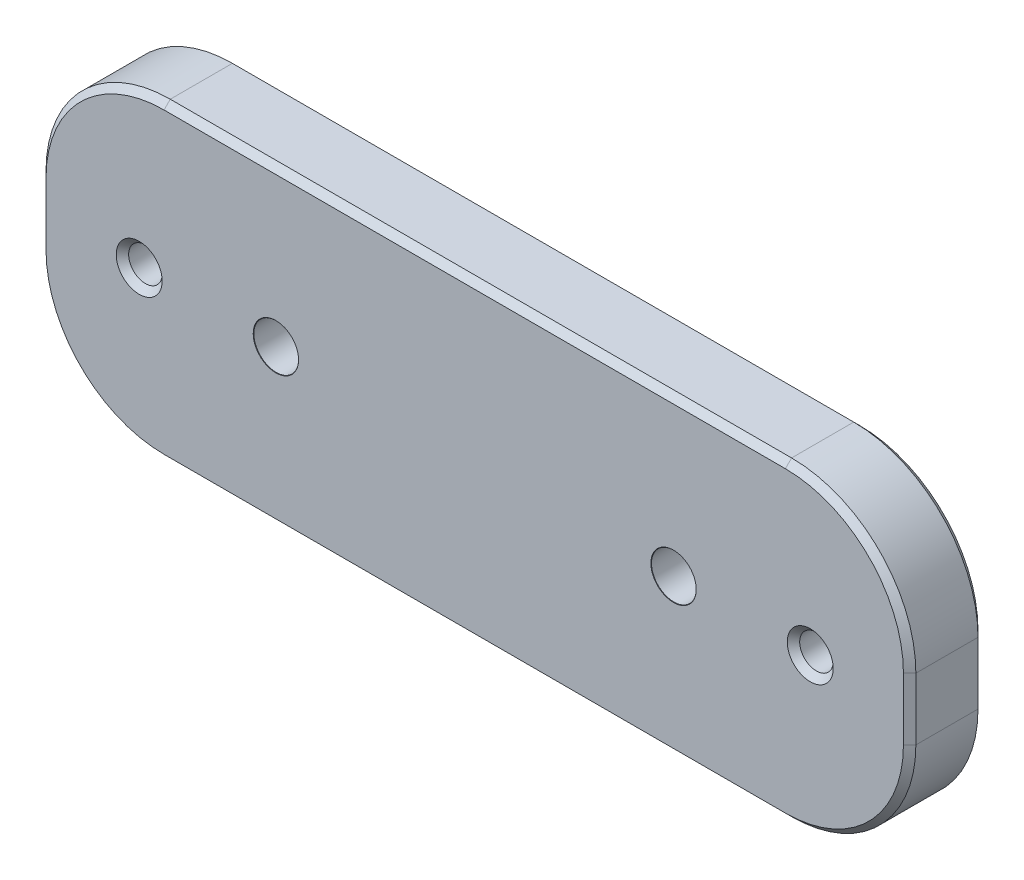
ISO-10303-21;
HEADER;
FILE_DESCRIPTION(('STEP AP214'),'2;1');
FILE_NAME('part.step','',(''),(''),'','','');
FILE_SCHEMA(('AUTOMOTIVE_DESIGN { 1 0 10303 214 1 1 1 1 }'));
ENDSEC;
DATA;
#1=APPLICATION_CONTEXT('core data for automotive mechanical design processes');
#2=APPLICATION_PROTOCOL_DEFINITION('international standard','automotive_design',2000,#1);
#3=PRODUCT_CONTEXT('',#1,'mechanical');
#4=PRODUCT('Part','Part','',(#3));
#5=PRODUCT_RELATED_PRODUCT_CATEGORY('part','',(#4));
#6=PRODUCT_DEFINITION_FORMATION('','',#4);
#7=PRODUCT_DEFINITION_CONTEXT('part definition',#1,'design');
#8=PRODUCT_DEFINITION('design','',#6,#7);
#9=PRODUCT_DEFINITION_SHAPE('','',#8);
#10=(LENGTH_UNIT() NAMED_UNIT(*) SI_UNIT(.MILLI.,.METRE.));
#11=(NAMED_UNIT(*) PLANE_ANGLE_UNIT() SI_UNIT($,.RADIAN.));
#12=(NAMED_UNIT(*) SI_UNIT($,.STERADIAN.) SOLID_ANGLE_UNIT());
#13=UNCERTAINTY_MEASURE_WITH_UNIT(LENGTH_MEASURE(1.E-05),#10,'distance_accuracy_value','');
#14=(GEOMETRIC_REPRESENTATION_CONTEXT(3) GLOBAL_UNCERTAINTY_ASSIGNED_CONTEXT((#13)) GLOBAL_UNIT_ASSIGNED_CONTEXT((#10,
#11,#12)) REPRESENTATION_CONTEXT('',''));
#15=CARTESIAN_POINT('',(0.,0.,0.));
#16=DIRECTION('',(0.,0.,1.));
#17=DIRECTION('',(1.,0.,0.));
#18=AXIS2_PLACEMENT_3D('',#15,#16,#17);
#19=CARTESIAN_POINT('',(0.,0.,0.));
#20=DIRECTION('',(0.,0.,1.));
#21=DIRECTION('',(1.,0.,0.));
#22=AXIS2_PLACEMENT_3D('',#19,#20,#21);
#23=PLANE('',#22);
#24=CARTESIAN_POINT('',(-16.,0.,0.));
#25=DIRECTION('',(0.,0.,-1.));
#26=DIRECTION('',(-1.,0.,0.));
#27=AXIS2_PLACEMENT_3D('',#24,#25,#26);
#28=CIRCLE('',#27,4.15);
#29=CARTESIAN_POINT('',(-20.15,0.,0.));
#30=VERTEX_POINT('',#29);
#31=EDGE_CURVE('E385',#30,#30,#28,.T.);
#32=ORIENTED_EDGE('',*,*,#31,.F.);
#33=EDGE_LOOP('',(#32));
#34=FACE_BOUND('',#33,.T.);
#35=CARTESIAN_POINT('',(-27.,0.,0.));
#36=DIRECTION('',(0.,0.,1.));
#37=DIRECTION('',(1.,0.,0.));
#38=AXIS2_PLACEMENT_3D('',#35,#36,#37);
#39=CIRCLE('',#38,1.84999999999999);
#40=CARTESIAN_POINT('',(-25.15,0.,0.));
#41=VERTEX_POINT('',#40);
#42=EDGE_CURVE('E346',#41,#41,#39,.T.);
#43=ORIENTED_EDGE('',*,*,#42,.T.);
#44=EDGE_LOOP('',(#43));
#45=FACE_BOUND('',#44,.T.);
#46=CARTESIAN_POINT('',(27.,0.,0.));
#47=DIRECTION('',(0.,0.,1.));
#48=DIRECTION('',(1.,0.,0.));
#49=AXIS2_PLACEMENT_3D('',#46,#47,#48);
#50=CIRCLE('',#49,1.84999999999999);
#51=CARTESIAN_POINT('',(28.85,0.,0.));
#52=VERTEX_POINT('',#51);
#53=EDGE_CURVE('E344',#52,#52,#50,.T.);
#54=ORIENTED_EDGE('',*,*,#53,.T.);
#55=EDGE_LOOP('',(#54));
#56=FACE_BOUND('',#55,.T.);
#57=DIRECTION('',(0.,1.,0.));
#58=VECTOR('',#57,1.);
#59=CARTESIAN_POINT('',(-34.5,0.,0.));
#60=LINE('',#59,#58);
#61=CARTESIAN_POINT('',(-34.5,-2.5,0.));
#62=VERTEX_POINT('',#61);
#63=CARTESIAN_POINT('',(-34.5,2.5,0.));
#64=VERTEX_POINT('',#63);
#65=EDGE_CURVE('E52',#62,#64,#60,.T.);
#66=ORIENTED_EDGE('',*,*,#65,.T.);
#67=CARTESIAN_POINT('',(-25.,2.5,0.));
#68=DIRECTION('',(0.,0.,1.));
#69=DIRECTION('',(1.,0.,0.));
#70=AXIS2_PLACEMENT_3D('',#67,#68,#69);
#71=CIRCLE('',#70,9.5);
#72=CARTESIAN_POINT('',(-25.,12.,0.));
#73=VERTEX_POINT('',#72);
#74=EDGE_CURVE('E11',#64,#73,#71,.F.);
#75=ORIENTED_EDGE('',*,*,#74,.T.);
#76=DIRECTION('',(1.,0.,0.));
#77=VECTOR('',#76,1.);
#78=CARTESIAN_POINT('',(0.,12.,0.));
#79=LINE('',#78,#77);
#80=CARTESIAN_POINT('',(25.,12.,0.));
#81=VERTEX_POINT('',#80);
#82=EDGE_CURVE('E41',#73,#81,#79,.T.);
#83=ORIENTED_EDGE('',*,*,#82,.T.);
#84=CARTESIAN_POINT('',(25.,2.5,0.));
#85=DIRECTION('',(0.,0.,1.));
#86=DIRECTION('',(1.,0.,0.));
#87=AXIS2_PLACEMENT_3D('',#84,#85,#86);
#88=CIRCLE('',#87,9.5);
#89=CARTESIAN_POINT('',(34.5,2.5,0.));
#90=VERTEX_POINT('',#89);
#91=EDGE_CURVE('E225',#81,#90,#88,.F.);
#92=ORIENTED_EDGE('',*,*,#91,.T.);
#93=DIRECTION('',(0.,-1.,0.));
#94=VECTOR('',#93,1.);
#95=CARTESIAN_POINT('',(34.5,0.,0.));
#96=LINE('',#95,#94);
#97=CARTESIAN_POINT('',(34.5,-2.5,0.));
#98=VERTEX_POINT('',#97);
#99=EDGE_CURVE('E223',#90,#98,#96,.T.);
#100=ORIENTED_EDGE('',*,*,#99,.T.);
#101=CARTESIAN_POINT('',(25.,-2.5,0.));
#102=DIRECTION('',(0.,0.,1.));
#103=DIRECTION('',(1.,0.,0.));
#104=AXIS2_PLACEMENT_3D('',#101,#102,#103);
#105=CIRCLE('',#104,9.5);
#106=CARTESIAN_POINT('',(25.,-12.,0.));
#107=VERTEX_POINT('',#106);
#108=EDGE_CURVE('E227',#98,#107,#105,.F.);
#109=ORIENTED_EDGE('',*,*,#108,.T.);
#110=DIRECTION('',(-1.,0.,0.));
#111=VECTOR('',#110,1.);
#112=CARTESIAN_POINT('',(0.,-12.,0.));
#113=LINE('',#112,#111);
#114=CARTESIAN_POINT('',(-25.,-12.,0.));
#115=VERTEX_POINT('',#114);
#116=EDGE_CURVE('E229',#107,#115,#113,.T.);
#117=ORIENTED_EDGE('',*,*,#116,.T.);
#118=CARTESIAN_POINT('',(-25.,-2.5,0.));
#119=DIRECTION('',(0.,0.,1.));
#120=DIRECTION('',(1.,0.,0.));
#121=AXIS2_PLACEMENT_3D('',#118,#119,#120);
#122=CIRCLE('',#121,9.5);
#123=EDGE_CURVE('E231',#115,#62,#122,.F.);
#124=ORIENTED_EDGE('',*,*,#123,.T.);
#125=EDGE_LOOP('',(#66,#75,#83,#92,#100,#109,#117,#124));
#126=FACE_BOUND('',#125,.T.);
#127=CARTESIAN_POINT('',(16.,0.,0.));
#128=DIRECTION('',(0.,0.,-1.));
#129=DIRECTION('',(-1.,0.,0.));
#130=AXIS2_PLACEMENT_3D('',#127,#128,#129);
#131=CIRCLE('',#130,4.15);
#132=CARTESIAN_POINT('',(11.85,0.,0.));
#133=VERTEX_POINT('',#132);
#134=EDGE_CURVE('E373',#133,#133,#131,.T.);
#135=ORIENTED_EDGE('',*,*,#134,.F.);
#136=EDGE_LOOP('',(#135));
#137=FACE_BOUND('',#136,.T.);
#138=ADVANCED_FACE('F32',(#34,#45,#56,#126,#137),#23,.F.);
#139=CARTESIAN_POINT('',(0.,0.,6.));
#140=DIRECTION('',(0.,0.,1.));
#141=DIRECTION('',(1.,0.,0.));
#142=AXIS2_PLACEMENT_3D('',#139,#140,#141);
#143=PLANE('',#142);
#144=CARTESIAN_POINT('',(-16.,0.,6.));
#145=DIRECTION('',(0.,0.,-1.));
#146=DIRECTION('',(-1.,0.,0.));
#147=AXIS2_PLACEMENT_3D('',#144,#145,#146);
#148=CIRCLE('',#147,1.825);
#149=CARTESIAN_POINT('',(-17.825,0.,6.));
#150=VERTEX_POINT('',#149);
#151=EDGE_CURVE('E388',#150,#150,#148,.T.);
#152=ORIENTED_EDGE('',*,*,#151,.T.);
#153=EDGE_LOOP('',(#152));
#154=FACE_BOUND('',#153,.T.);
#155=CARTESIAN_POINT('',(16.,0.,6.));
#156=DIRECTION('',(0.,0.,-1.));
#157=DIRECTION('',(-1.,0.,0.));
#158=AXIS2_PLACEMENT_3D('',#155,#156,#157);
#159=CIRCLE('',#158,1.825);
#160=CARTESIAN_POINT('',(14.175,0.,6.));
#161=VERTEX_POINT('',#160);
#162=EDGE_CURVE('E376',#161,#161,#159,.T.);
#163=ORIENTED_EDGE('',*,*,#162,.T.);
#164=EDGE_LOOP('',(#163));
#165=FACE_BOUND('',#164,.T.);
#166=DIRECTION('',(-1.,0.,0.));
#167=VECTOR('',#166,1.);
#168=CARTESIAN_POINT('',(-25.,12.,6.));
#169=LINE('',#168,#167);
#170=CARTESIAN_POINT('',(25.,12.,6.));
#171=VERTEX_POINT('',#170);
#172=CARTESIAN_POINT('',(-25.,12.,6.));
#173=VERTEX_POINT('',#172);
#174=EDGE_CURVE('E186',#171,#173,#169,.T.);
#175=ORIENTED_EDGE('',*,*,#174,.T.);
#176=CARTESIAN_POINT('',(-25.,2.5,6.));
#177=DIRECTION('',(0.,0.,1.));
#178=DIRECTION('',(1.,0.,0.));
#179=AXIS2_PLACEMENT_3D('',#176,#177,#178);
#180=CIRCLE('',#179,9.5);
#181=CARTESIAN_POINT('',(-34.5,2.5,6.));
#182=VERTEX_POINT('',#181);
#183=EDGE_CURVE('E188',#173,#182,#180,.T.);
#184=ORIENTED_EDGE('',*,*,#183,.T.);
#185=DIRECTION('',(0.,-1.,0.));
#186=VECTOR('',#185,1.);
#187=CARTESIAN_POINT('',(-34.5,-2.5,6.));
#188=LINE('',#187,#186);
#189=CARTESIAN_POINT('',(-34.5,-2.5,6.));
#190=VERTEX_POINT('',#189);
#191=EDGE_CURVE('E184',#182,#190,#188,.T.);
#192=ORIENTED_EDGE('',*,*,#191,.T.);
#193=CARTESIAN_POINT('',(-25.,-2.5,6.));
#194=DIRECTION('',(0.,0.,1.));
#195=DIRECTION('',(1.,0.,0.));
#196=AXIS2_PLACEMENT_3D('',#193,#194,#195);
#197=CIRCLE('',#196,9.5);
#198=CARTESIAN_POINT('',(-25.,-12.,6.));
#199=VERTEX_POINT('',#198);
#200=EDGE_CURVE('E182',#190,#199,#197,.T.);
#201=ORIENTED_EDGE('',*,*,#200,.T.);
#202=DIRECTION('',(1.,0.,0.));
#203=VECTOR('',#202,1.);
#204=CARTESIAN_POINT('',(25.,-12.,6.));
#205=LINE('',#204,#203);
#206=CARTESIAN_POINT('',(25.,-12.,6.));
#207=VERTEX_POINT('',#206);
#208=EDGE_CURVE('E153',#199,#207,#205,.T.);
#209=ORIENTED_EDGE('',*,*,#208,.T.);
#210=CARTESIAN_POINT('',(25.,-2.5,6.));
#211=DIRECTION('',(0.,0.,1.));
#212=DIRECTION('',(1.,0.,0.));
#213=AXIS2_PLACEMENT_3D('',#210,#211,#212);
#214=CIRCLE('',#213,9.5);
#215=CARTESIAN_POINT('',(34.5,-2.5,6.));
#216=VERTEX_POINT('',#215);
#217=EDGE_CURVE('E144',#207,#216,#214,.T.);
#218=ORIENTED_EDGE('',*,*,#217,.T.);
#219=DIRECTION('',(0.,1.,0.));
#220=VECTOR('',#219,1.);
#221=CARTESIAN_POINT('',(34.5,2.5,6.));
#222=LINE('',#221,#220);
#223=CARTESIAN_POINT('',(34.5,2.5,6.));
#224=VERTEX_POINT('',#223);
#225=EDGE_CURVE('E150',#216,#224,#222,.T.);
#226=ORIENTED_EDGE('',*,*,#225,.T.);
#227=CARTESIAN_POINT('',(25.,2.5,6.));
#228=DIRECTION('',(0.,0.,1.));
#229=DIRECTION('',(1.,0.,0.));
#230=AXIS2_PLACEMENT_3D('',#227,#228,#229);
#231=CIRCLE('',#230,9.5);
#232=EDGE_CURVE('E157',#224,#171,#231,.T.);
#233=ORIENTED_EDGE('',*,*,#232,.T.);
#234=EDGE_LOOP('',(#175,#184,#192,#201,#209,#218,#226,#233));
#235=FACE_BOUND('',#234,.T.);
#236=CARTESIAN_POINT('',(27.,0.,6.));
#237=DIRECTION('',(0.,0.,1.));
#238=DIRECTION('',(1.,0.,0.));
#239=AXIS2_PLACEMENT_3D('',#236,#237,#238);
#240=CIRCLE('',#239,1.84999999999999);
#241=CARTESIAN_POINT('',(28.85,0.,6.));
#242=VERTEX_POINT('',#241);
#243=EDGE_CURVE('E357',#242,#242,#240,.F.);
#244=ORIENTED_EDGE('',*,*,#243,.T.);
#245=EDGE_LOOP('',(#244));
#246=FACE_BOUND('',#245,.T.);
#247=CARTESIAN_POINT('',(-27.,0.,6.));
#248=DIRECTION('',(0.,0.,1.));
#249=DIRECTION('',(1.,0.,0.));
#250=AXIS2_PLACEMENT_3D('',#247,#248,#249);
#251=CIRCLE('',#250,1.84999999999999);
#252=CARTESIAN_POINT('',(-25.15,0.,6.));
#253=VERTEX_POINT('',#252);
#254=EDGE_CURVE('E360',#253,#253,#251,.F.);
#255=ORIENTED_EDGE('',*,*,#254,.T.);
#256=EDGE_LOOP('',(#255));
#257=FACE_BOUND('',#256,.T.);
#258=ADVANCED_FACE('F147',(#154,#165,#235,#246,#257),#143,.T.);
#259=CARTESIAN_POINT('',(35.,12.5,6.));
#260=DIRECTION('',(-1.,0.,0.));
#261=DIRECTION('',(0.,0.,1.));
#262=AXIS2_PLACEMENT_3D('',#259,#260,#261);
#263=PLANE('',#262);
#264=DIRECTION('',(0.,0.,-1.));
#265=VECTOR('',#264,1.);
#266=CARTESIAN_POINT('',(35.,2.5,6.));
#267=LINE('',#266,#265);
#268=CARTESIAN_POINT('',(35.,2.5,0.5));
#269=VERTEX_POINT('',#268);
#270=CARTESIAN_POINT('',(35.,2.5,5.5));
#271=VERTEX_POINT('',#270);
#272=EDGE_CURVE('E302',#269,#271,#267,.F.);
#273=ORIENTED_EDGE('',*,*,#272,.T.);
#274=DIRECTION('',(0.,-1.,0.));
#275=VECTOR('',#274,1.);
#276=CARTESIAN_POINT('',(35.,-2.5,5.5));
#277=LINE('',#276,#275);
#278=CARTESIAN_POINT('',(35.,-2.5,5.5));
#279=VERTEX_POINT('',#278);
#280=EDGE_CURVE('E221',#271,#279,#277,.T.);
#281=ORIENTED_EDGE('',*,*,#280,.T.);
#282=DIRECTION('',(0.,0.,-1.));
#283=VECTOR('',#282,1.);
#284=CARTESIAN_POINT('',(35.,-2.5,6.));
#285=LINE('',#284,#283);
#286=CARTESIAN_POINT('',(35.,-2.5,0.5));
#287=VERTEX_POINT('',#286);
#288=EDGE_CURVE('E311',#279,#287,#285,.T.);
#289=ORIENTED_EDGE('',*,*,#288,.T.);
#290=DIRECTION('',(0.,1.,0.));
#291=VECTOR('',#290,1.);
#292=CARTESIAN_POINT('',(35.,12.5,0.5));
#293=LINE('',#292,#291);
#294=EDGE_CURVE('E219',#287,#269,#293,.T.);
#295=ORIENTED_EDGE('',*,*,#294,.T.);
#296=EDGE_LOOP('',(#273,#281,#289,#295));
#297=FACE_BOUND('',#296,.T.);
#298=ADVANCED_FACE('F559',(#297),#263,.F.);
#299=CARTESIAN_POINT('',(-35.,12.5,6.));
#300=DIRECTION('',(0.,-1.,0.));
#301=DIRECTION('',(0.,0.,-1.));
#302=AXIS2_PLACEMENT_3D('',#299,#300,#301);
#303=PLANE('',#302);
#304=DIRECTION('',(0.,0.,-1.));
#305=VECTOR('',#304,1.);
#306=CARTESIAN_POINT('',(-25.,12.5,6.));
#307=LINE('',#306,#305);
#308=CARTESIAN_POINT('',(-25.,12.5,0.5));
#309=VERTEX_POINT('',#308);
#310=CARTESIAN_POINT('',(-25.,12.5,5.5));
#311=VERTEX_POINT('',#310);
#312=EDGE_CURVE('E308',#309,#311,#307,.F.);
#313=ORIENTED_EDGE('',*,*,#312,.T.);
#314=DIRECTION('',(1.,0.,0.));
#315=VECTOR('',#314,1.);
#316=CARTESIAN_POINT('',(25.,12.5,5.50000000000001));
#317=LINE('',#316,#315);
#318=CARTESIAN_POINT('',(25.,12.5,5.5));
#319=VERTEX_POINT('',#318);
#320=EDGE_CURVE('E193',#311,#319,#317,.T.);
#321=ORIENTED_EDGE('',*,*,#320,.T.);
#322=DIRECTION('',(0.,0.,-1.));
#323=VECTOR('',#322,1.);
#324=CARTESIAN_POINT('',(25.,12.5,6.));
#325=LINE('',#324,#323);
#326=CARTESIAN_POINT('',(25.,12.5,0.5));
#327=VERTEX_POINT('',#326);
#328=EDGE_CURVE('E300',#319,#327,#325,.T.);
#329=ORIENTED_EDGE('',*,*,#328,.T.);
#330=DIRECTION('',(-1.,0.,0.));
#331=VECTOR('',#330,1.);
#332=CARTESIAN_POINT('',(-35.,12.5,0.499999999999987));
#333=LINE('',#332,#331);
#334=EDGE_CURVE('E190',#327,#309,#333,.T.);
#335=ORIENTED_EDGE('',*,*,#334,.T.);
#336=EDGE_LOOP('',(#313,#321,#329,#335));
#337=FACE_BOUND('',#336,.T.);
#338=ADVANCED_FACE('F305',(#337),#303,.F.);
#339=CARTESIAN_POINT('',(-35.,12.5,6.));
#340=DIRECTION('',(1.,0.,0.));
#341=DIRECTION('',(0.,0.,-1.));
#342=AXIS2_PLACEMENT_3D('',#339,#340,#341);
#343=PLANE('',#342);
#344=DIRECTION('',(0.,0.,-1.));
#345=VECTOR('',#344,1.);
#346=CARTESIAN_POINT('',(-35.,-2.5,6.));
#347=LINE('',#346,#345);
#348=CARTESIAN_POINT('',(-35.,-2.5,0.5));
#349=VERTEX_POINT('',#348);
#350=CARTESIAN_POINT('',(-35.,-2.5,5.5));
#351=VERTEX_POINT('',#350);
#352=EDGE_CURVE('E314',#349,#351,#347,.F.);
#353=ORIENTED_EDGE('',*,*,#352,.T.);
#354=DIRECTION('',(0.,1.,0.));
#355=VECTOR('',#354,1.);
#356=CARTESIAN_POINT('',(-35.,2.5,5.5));
#357=LINE('',#356,#355);
#358=CARTESIAN_POINT('',(-35.,2.5,5.5));
#359=VERTEX_POINT('',#358);
#360=EDGE_CURVE('E198',#351,#359,#357,.T.);
#361=ORIENTED_EDGE('',*,*,#360,.T.);
#362=DIRECTION('',(0.,0.,-1.));
#363=VECTOR('',#362,1.);
#364=CARTESIAN_POINT('',(-35.,2.5,6.));
#365=LINE('',#364,#363);
#366=CARTESIAN_POINT('',(-35.,2.5,0.5));
#367=VERTEX_POINT('',#366);
#368=EDGE_CURVE('E309',#359,#367,#365,.T.);
#369=ORIENTED_EDGE('',*,*,#368,.T.);
#370=DIRECTION('',(0.,-1.,0.));
#371=VECTOR('',#370,1.);
#372=CARTESIAN_POINT('',(-35.,12.5,0.5));
#373=LINE('',#372,#371);
#374=EDGE_CURVE('E196',#367,#349,#373,.T.);
#375=ORIENTED_EDGE('',*,*,#374,.T.);
#376=EDGE_LOOP('',(#353,#361,#369,#375));
#377=FACE_BOUND('',#376,.T.);
#378=ADVANCED_FACE('F341',(#377),#343,.F.);
#379=CARTESIAN_POINT('',(-35.,-12.5,6.));
#380=DIRECTION('',(0.,1.,0.));
#381=DIRECTION('',(0.,0.,1.));
#382=AXIS2_PLACEMENT_3D('',#379,#380,#381);
#383=PLANE('',#382);
#384=DIRECTION('',(0.,0.,-1.));
#385=VECTOR('',#384,1.);
#386=CARTESIAN_POINT('',(25.,-12.5,6.));
#387=LINE('',#386,#385);
#388=CARTESIAN_POINT('',(25.,-12.5,0.5));
#389=VERTEX_POINT('',#388);
#390=CARTESIAN_POINT('',(25.,-12.5,5.5));
#391=VERTEX_POINT('',#390);
#392=EDGE_CURVE('E177',#389,#391,#387,.F.);
#393=ORIENTED_EDGE('',*,*,#392,.T.);
#394=DIRECTION('',(-1.,0.,0.));
#395=VECTOR('',#394,1.);
#396=CARTESIAN_POINT('',(-25.,-12.5,5.5));
#397=LINE('',#396,#395);
#398=CARTESIAN_POINT('',(-25.,-12.5,5.5));
#399=VERTEX_POINT('',#398);
#400=EDGE_CURVE('E210',#391,#399,#397,.T.);
#401=ORIENTED_EDGE('',*,*,#400,.T.);
#402=DIRECTION('',(0.,0.,-1.));
#403=VECTOR('',#402,1.);
#404=CARTESIAN_POINT('',(-25.,-12.5,6.));
#405=LINE('',#404,#403);
#406=CARTESIAN_POINT('',(-25.,-12.5,0.5));
#407=VERTEX_POINT('',#406);
#408=EDGE_CURVE('E173',#399,#407,#405,.T.);
#409=ORIENTED_EDGE('',*,*,#408,.T.);
#410=DIRECTION('',(1.,0.,0.));
#411=VECTOR('',#410,1.);
#412=CARTESIAN_POINT('',(-35.,-12.5,0.5));
#413=LINE('',#412,#411);
#414=EDGE_CURVE('E208',#407,#389,#413,.T.);
#415=ORIENTED_EDGE('',*,*,#414,.T.);
#416=EDGE_LOOP('',(#393,#401,#409,#415));
#417=FACE_BOUND('',#416,.T.);
#418=ADVANCED_FACE('F324',(#417),#383,.F.);
#419=CARTESIAN_POINT('',(-27.,0.,6.));
#420=DIRECTION('',(0.,0.,-1.));
#421=DIRECTION('',(-1.,0.,0.));
#422=AXIS2_PLACEMENT_3D('',#419,#420,#421);
#423=CYLINDRICAL_SURFACE('',#422,1.35);
#424=CARTESIAN_POINT('',(-27.,0.,5.50000000000001));
#425=DIRECTION('',(0.,0.,1.));
#426=DIRECTION('',(1.,0.,0.));
#427=AXIS2_PLACEMENT_3D('',#424,#425,#426);
#428=CIRCLE('',#427,1.35);
#429=CARTESIAN_POINT('',(-25.65,0.,5.50000000000001));
#430=VERTEX_POINT('',#429);
#431=EDGE_CURVE('E351',#430,#430,#428,.T.);
#432=ORIENTED_EDGE('',*,*,#431,.T.);
#433=EDGE_LOOP('',(#432));
#434=FACE_BOUND('',#433,.T.);
#435=CARTESIAN_POINT('',(-27.,0.,0.499999999999995));
#436=DIRECTION('',(0.,0.,1.));
#437=DIRECTION('',(1.,0.,0.));
#438=AXIS2_PLACEMENT_3D('',#435,#436,#437);
#439=CIRCLE('',#438,1.35);
#440=CARTESIAN_POINT('',(-25.65,0.,0.499999999999995));
#441=VERTEX_POINT('',#440);
#442=EDGE_CURVE('E354',#441,#441,#439,.F.);
#443=ORIENTED_EDGE('',*,*,#442,.T.);
#444=EDGE_LOOP('',(#443));
#445=FACE_BOUND('',#444,.T.);
#446=ADVANCED_FACE('F589',(#434,#445),#423,.F.);
#447=CARTESIAN_POINT('',(27.,0.,6.));
#448=DIRECTION('',(0.,0.,-1.));
#449=DIRECTION('',(-1.,0.,0.));
#450=AXIS2_PLACEMENT_3D('',#447,#448,#449);
#451=CYLINDRICAL_SURFACE('',#450,1.35);
#452=CARTESIAN_POINT('',(27.,0.,5.50000000000001));
#453=DIRECTION('',(0.,0.,1.));
#454=DIRECTION('',(1.,0.,0.));
#455=AXIS2_PLACEMENT_3D('',#452,#453,#454);
#456=CIRCLE('',#455,1.35);
#457=CARTESIAN_POINT('',(28.35,0.,5.50000000000001));
#458=VERTEX_POINT('',#457);
#459=EDGE_CURVE('E363',#458,#458,#456,.T.);
#460=ORIENTED_EDGE('',*,*,#459,.T.);
#461=EDGE_LOOP('',(#460));
#462=FACE_BOUND('',#461,.T.);
#463=CARTESIAN_POINT('',(27.,0.,0.499999999999995));
#464=DIRECTION('',(0.,0.,1.));
#465=DIRECTION('',(1.,0.,0.));
#466=AXIS2_PLACEMENT_3D('',#463,#464,#465);
#467=CIRCLE('',#466,1.35);
#468=CARTESIAN_POINT('',(28.35,0.,0.499999999999995));
#469=VERTEX_POINT('',#468);
#470=EDGE_CURVE('E249',#469,#469,#467,.F.);
#471=ORIENTED_EDGE('',*,*,#470,.T.);
#472=EDGE_LOOP('',(#471));
#473=FACE_BOUND('',#472,.T.);
#474=ADVANCED_FACE('F599',(#462,#473),#451,.F.);
#475=CARTESIAN_POINT('',(27.,0.,5.50000000000001));
#476=DIRECTION('',(0.,0.,1.));
#477=DIRECTION('',(1.,0.,0.));
#478=AXIS2_PLACEMENT_3D('',#475,#476,#477);
#479=CONICAL_SURFACE('',#478,1.35,0.785398163397447);
#480=ORIENTED_EDGE('',*,*,#243,.F.);
#481=EDGE_LOOP('',(#480));
#482=FACE_BOUND('',#481,.T.);
#483=ORIENTED_EDGE('',*,*,#459,.F.);
#484=EDGE_LOOP('',(#483));
#485=FACE_BOUND('',#484,.T.);
#486=ADVANCED_FACE('F433',(#482,#485),#479,.F.);
#487=CARTESIAN_POINT('',(-27.,0.,5.50000000000001));
#488=DIRECTION('',(0.,0.,1.));
#489=DIRECTION('',(1.,0.,0.));
#490=AXIS2_PLACEMENT_3D('',#487,#488,#489);
#491=CONICAL_SURFACE('',#490,1.35,0.785398163397447);
#492=ORIENTED_EDGE('',*,*,#254,.F.);
#493=EDGE_LOOP('',(#492));
#494=FACE_BOUND('',#493,.T.);
#495=ORIENTED_EDGE('',*,*,#431,.F.);
#496=EDGE_LOOP('',(#495));
#497=FACE_BOUND('',#496,.T.);
#498=ADVANCED_FACE('F423',(#494,#497),#491,.F.);
#499=CARTESIAN_POINT('',(27.,0.,0.));
#500=DIRECTION('',(0.,0.,-1.));
#501=DIRECTION('',(-1.,0.,0.));
#502=AXIS2_PLACEMENT_3D('',#499,#500,#501);
#503=CONICAL_SURFACE('',#502,1.84999999999999,0.785398163397438);
#504=ORIENTED_EDGE('',*,*,#470,.F.);
#505=EDGE_LOOP('',(#504));
#506=FACE_BOUND('',#505,.T.);
#507=ORIENTED_EDGE('',*,*,#53,.F.);
#508=EDGE_LOOP('',(#507));
#509=FACE_BOUND('',#508,.T.);
#510=ADVANCED_FACE('F420',(#506,#509),#503,.F.);
#511=CARTESIAN_POINT('',(-27.,0.,0.));
#512=DIRECTION('',(0.,0.,-1.));
#513=DIRECTION('',(-1.,0.,0.));
#514=AXIS2_PLACEMENT_3D('',#511,#512,#513);
#515=CONICAL_SURFACE('',#514,1.84999999999999,0.785398163397445);
#516=ORIENTED_EDGE('',*,*,#442,.F.);
#517=EDGE_LOOP('',(#516));
#518=FACE_BOUND('',#517,.T.);
#519=ORIENTED_EDGE('',*,*,#42,.F.);
#520=EDGE_LOOP('',(#519));
#521=FACE_BOUND('',#520,.T.);
#522=ADVANCED_FACE('F422',(#518,#521),#515,.F.);
#523=CARTESIAN_POINT('',(-25.,2.5,6.));
#524=DIRECTION('',(0.,0.,-1.));
#525=DIRECTION('',(-1.,0.,0.));
#526=AXIS2_PLACEMENT_3D('',#523,#524,#525);
#527=CYLINDRICAL_SURFACE('',#526,10.);
#528=ORIENTED_EDGE('',*,*,#368,.F.);
#529=CARTESIAN_POINT('',(-25.,2.5,5.5));
#530=DIRECTION('',(0.,0.,1.));
#531=DIRECTION('',(1.,0.,0.));
#532=AXIS2_PLACEMENT_3D('',#529,#530,#531);
#533=CIRCLE('',#532,10.);
#534=EDGE_CURVE('E206',#359,#311,#533,.F.);
#535=ORIENTED_EDGE('',*,*,#534,.T.);
#536=ORIENTED_EDGE('',*,*,#312,.F.);
#537=CARTESIAN_POINT('',(-25.,2.5,0.5));
#538=DIRECTION('',(0.,0.,1.));
#539=DIRECTION('',(1.,0.,0.));
#540=AXIS2_PLACEMENT_3D('',#537,#538,#539);
#541=CIRCLE('',#540,10.);
#542=EDGE_CURVE('E204',#309,#367,#541,.T.);
#543=ORIENTED_EDGE('',*,*,#542,.T.);
#544=EDGE_LOOP('',(#528,#535,#536,#543));
#545=FACE_BOUND('',#544,.T.);
#546=ADVANCED_FACE('F430',(#545),#527,.T.);
#547=CARTESIAN_POINT('',(25.,2.5,6.));
#548=DIRECTION('',(0.,0.,-1.));
#549=DIRECTION('',(-1.,0.,0.));
#550=AXIS2_PLACEMENT_3D('',#547,#548,#549);
#551=CYLINDRICAL_SURFACE('',#550,10.);
#552=ORIENTED_EDGE('',*,*,#328,.F.);
#553=CARTESIAN_POINT('',(25.,2.5,5.5));
#554=DIRECTION('',(0.,0.,1.));
#555=DIRECTION('',(1.,0.,0.));
#556=AXIS2_PLACEMENT_3D('',#553,#554,#555);
#557=CIRCLE('',#556,10.);
#558=EDGE_CURVE('E217',#319,#271,#557,.F.);
#559=ORIENTED_EDGE('',*,*,#558,.T.);
#560=ORIENTED_EDGE('',*,*,#272,.F.);
#561=CARTESIAN_POINT('',(25.,2.5,0.5));
#562=DIRECTION('',(0.,0.,1.));
#563=DIRECTION('',(1.,0.,0.));
#564=AXIS2_PLACEMENT_3D('',#561,#562,#563);
#565=CIRCLE('',#564,10.);
#566=EDGE_CURVE('E215',#269,#327,#565,.T.);
#567=ORIENTED_EDGE('',*,*,#566,.T.);
#568=EDGE_LOOP('',(#552,#559,#560,#567));
#569=FACE_BOUND('',#568,.T.);
#570=ADVANCED_FACE('F299',(#569),#551,.T.);
#571=CARTESIAN_POINT('',(-25.,-2.5,6.));
#572=DIRECTION('',(0.,0.,-1.));
#573=DIRECTION('',(-1.,0.,0.));
#574=AXIS2_PLACEMENT_3D('',#571,#572,#573);
#575=CYLINDRICAL_SURFACE('',#574,10.);
#576=ORIENTED_EDGE('',*,*,#408,.F.);
#577=CARTESIAN_POINT('',(-25.,-2.5,5.5));
#578=DIRECTION('',(0.,0.,1.));
#579=DIRECTION('',(1.,0.,0.));
#580=AXIS2_PLACEMENT_3D('',#577,#578,#579);
#581=CIRCLE('',#580,10.);
#582=EDGE_CURVE('E202',#399,#351,#581,.F.);
#583=ORIENTED_EDGE('',*,*,#582,.T.);
#584=ORIENTED_EDGE('',*,*,#352,.F.);
#585=CARTESIAN_POINT('',(-25.,-2.5,0.5));
#586=DIRECTION('',(0.,0.,1.));
#587=DIRECTION('',(1.,0.,0.));
#588=AXIS2_PLACEMENT_3D('',#585,#586,#587);
#589=CIRCLE('',#588,10.);
#590=EDGE_CURVE('E200',#349,#407,#589,.T.);
#591=ORIENTED_EDGE('',*,*,#590,.T.);
#592=EDGE_LOOP('',(#576,#583,#584,#591));
#593=FACE_BOUND('',#592,.T.);
#594=ADVANCED_FACE('F339',(#593),#575,.T.);
#595=CARTESIAN_POINT('',(25.,-2.5,6.));
#596=DIRECTION('',(0.,0.,-1.));
#597=DIRECTION('',(-1.,0.,0.));
#598=AXIS2_PLACEMENT_3D('',#595,#596,#597);
#599=CYLINDRICAL_SURFACE('',#598,10.);
#600=ORIENTED_EDGE('',*,*,#288,.F.);
#601=CARTESIAN_POINT('',(25.,-2.5,5.5));
#602=DIRECTION('',(0.,0.,1.));
#603=DIRECTION('',(1.,0.,0.));
#604=AXIS2_PLACEMENT_3D('',#601,#602,#603);
#605=CIRCLE('',#604,10.);
#606=EDGE_CURVE('E163',#279,#391,#605,.F.);
#607=ORIENTED_EDGE('',*,*,#606,.T.);
#608=ORIENTED_EDGE('',*,*,#392,.F.);
#609=CARTESIAN_POINT('',(25.,-2.5,0.5));
#610=DIRECTION('',(0.,0.,1.));
#611=DIRECTION('',(1.,0.,0.));
#612=AXIS2_PLACEMENT_3D('',#609,#610,#611);
#613=CIRCLE('',#612,10.);
#614=EDGE_CURVE('E212',#389,#287,#613,.T.);
#615=ORIENTED_EDGE('',*,*,#614,.T.);
#616=EDGE_LOOP('',(#600,#607,#608,#615));
#617=FACE_BOUND('',#616,.T.);
#618=ADVANCED_FACE('F446',(#617),#599,.T.);
#619=CARTESIAN_POINT('',(0.,-12.,6.));
#620=DIRECTION('',(0.,-0.707106781186547,0.707106781186547));
#621=DIRECTION('',(-1.,0.,0.));
#622=AXIS2_PLACEMENT_3D('',#619,#620,#621);
#623=PLANE('',#622);
#624=DIRECTION('',(0.,0.707106781186547,0.707106781186547));
#625=VECTOR('',#624,1.);
#626=CARTESIAN_POINT('',(-25.,-12.5,5.5));
#627=LINE('',#626,#625);
#628=EDGE_CURVE('E166',#399,#199,#627,.T.);
#629=ORIENTED_EDGE('',*,*,#628,.F.);
#630=ORIENTED_EDGE('',*,*,#400,.F.);
#631=DIRECTION('',(0.,-0.707106781186547,-0.707106781186547));
#632=VECTOR('',#631,1.);
#633=CARTESIAN_POINT('',(25.,-12.,6.));
#634=LINE('',#633,#632);
#635=EDGE_CURVE('E247',#207,#391,#634,.T.);
#636=ORIENTED_EDGE('',*,*,#635,.F.);
#637=ORIENTED_EDGE('',*,*,#208,.F.);
#638=EDGE_LOOP('',(#629,#630,#636,#637));
#639=FACE_BOUND('',#638,.T.);
#640=ADVANCED_FACE('F329',(#639),#623,.T.);
#641=CARTESIAN_POINT('',(25.,-2.5,6.));
#642=DIRECTION('',(0.,0.,-1.));
#643=DIRECTION('',(-1.,0.,0.));
#644=AXIS2_PLACEMENT_3D('',#641,#642,#643);
#645=CONICAL_SURFACE('',#644,9.5,0.785398163397448);
#646=ORIENTED_EDGE('',*,*,#635,.T.);
#647=ORIENTED_EDGE('',*,*,#606,.F.);
#648=DIRECTION('',(0.707106781186547,0.,-0.707106781186547));
#649=VECTOR('',#648,1.);
#650=CARTESIAN_POINT('',(34.5,-2.5,6.));
#651=LINE('',#650,#649);
#652=EDGE_CURVE('E161',#216,#279,#651,.T.);
#653=ORIENTED_EDGE('',*,*,#652,.F.);
#654=ORIENTED_EDGE('',*,*,#217,.F.);
#655=EDGE_LOOP('',(#646,#647,#653,#654));
#656=FACE_BOUND('',#655,.T.);
#657=ADVANCED_FACE('F162',(#656),#645,.T.);
#658=CARTESIAN_POINT('',(-25.,-2.5,6.));
#659=DIRECTION('',(0.,0.,-1.));
#660=DIRECTION('',(-1.,0.,0.));
#661=AXIS2_PLACEMENT_3D('',#658,#659,#660);
#662=CONICAL_SURFACE('',#661,9.5,0.785398163397447);
#663=ORIENTED_EDGE('',*,*,#628,.T.);
#664=ORIENTED_EDGE('',*,*,#200,.F.);
#665=DIRECTION('',(0.707106781186547,0.,0.707106781186547));
#666=VECTOR('',#665,1.);
#667=CARTESIAN_POINT('',(-35.,-2.5,5.5));
#668=LINE('',#667,#666);
#669=EDGE_CURVE('E167',#351,#190,#668,.T.);
#670=ORIENTED_EDGE('',*,*,#669,.F.);
#671=ORIENTED_EDGE('',*,*,#582,.F.);
#672=EDGE_LOOP('',(#663,#664,#670,#671));
#673=FACE_BOUND('',#672,.T.);
#674=ADVANCED_FACE('F334',(#673),#662,.T.);
#675=CARTESIAN_POINT('',(34.5,0.,6.));
#676=DIRECTION('',(0.707106781186547,0.,0.707106781186547));
#677=DIRECTION('',(0.,-1.,0.));
#678=AXIS2_PLACEMENT_3D('',#675,#676,#677);
#679=PLANE('',#678);
#680=ORIENTED_EDGE('',*,*,#652,.T.);
#681=ORIENTED_EDGE('',*,*,#280,.F.);
#682=DIRECTION('',(0.707106781186547,0.,-0.707106781186547));
#683=VECTOR('',#682,1.);
#684=CARTESIAN_POINT('',(34.5,2.5,6.));
#685=LINE('',#684,#683);
#686=EDGE_CURVE('E171',#224,#271,#685,.T.);
#687=ORIENTED_EDGE('',*,*,#686,.F.);
#688=ORIENTED_EDGE('',*,*,#225,.F.);
#689=EDGE_LOOP('',(#680,#681,#687,#688));
#690=FACE_BOUND('',#689,.T.);
#691=ADVANCED_FACE('F169',(#690),#679,.T.);
#692=CARTESIAN_POINT('',(-34.5,0.,6.));
#693=DIRECTION('',(-0.707106781186547,0.,0.707106781186547));
#694=DIRECTION('',(0.,1.,0.));
#695=AXIS2_PLACEMENT_3D('',#692,#693,#694);
#696=PLANE('',#695);
#697=ORIENTED_EDGE('',*,*,#669,.T.);
#698=ORIENTED_EDGE('',*,*,#191,.F.);
#699=DIRECTION('',(0.707106781186547,0.,0.707106781186547));
#700=VECTOR('',#699,1.);
#701=CARTESIAN_POINT('',(-35.,2.5,5.5));
#702=LINE('',#701,#700);
#703=EDGE_CURVE('E239',#359,#182,#702,.T.);
#704=ORIENTED_EDGE('',*,*,#703,.F.);
#705=ORIENTED_EDGE('',*,*,#360,.F.);
#706=EDGE_LOOP('',(#697,#698,#704,#705));
#707=FACE_BOUND('',#706,.T.);
#708=ADVANCED_FACE('F460',(#707),#696,.T.);
#709=CARTESIAN_POINT('',(25.,2.5,6.));
#710=DIRECTION('',(0.,0.,-1.));
#711=DIRECTION('',(-1.,0.,0.));
#712=AXIS2_PLACEMENT_3D('',#709,#710,#711);
#713=CONICAL_SURFACE('',#712,9.5,0.785398163397447);
#714=ORIENTED_EDGE('',*,*,#686,.T.);
#715=ORIENTED_EDGE('',*,*,#558,.F.);
#716=DIRECTION('',(0.,0.707106781186546,-0.707106781186549));
#717=VECTOR('',#716,1.);
#718=CARTESIAN_POINT('',(25.,12.,6.));
#719=LINE('',#718,#717);
#720=EDGE_CURVE('E237',#171,#319,#719,.T.);
#721=ORIENTED_EDGE('',*,*,#720,.F.);
#722=ORIENTED_EDGE('',*,*,#232,.F.);
#723=EDGE_LOOP('',(#714,#715,#721,#722));
#724=FACE_BOUND('',#723,.T.);
#725=ADVANCED_FACE('F456',(#724),#713,.T.);
#726=CARTESIAN_POINT('',(-25.,2.5,6.));
#727=DIRECTION('',(0.,0.,-1.));
#728=DIRECTION('',(-1.,0.,0.));
#729=AXIS2_PLACEMENT_3D('',#726,#727,#728);
#730=CONICAL_SURFACE('',#729,9.5,0.785398163397448);
#731=ORIENTED_EDGE('',*,*,#703,.T.);
#732=ORIENTED_EDGE('',*,*,#183,.F.);
#733=DIRECTION('',(0.,-0.707106781186546,0.707106781186549));
#734=VECTOR('',#733,1.);
#735=CARTESIAN_POINT('',(-25.,12.5,5.5));
#736=LINE('',#735,#734);
#737=EDGE_CURVE('E235',#311,#173,#736,.T.);
#738=ORIENTED_EDGE('',*,*,#737,.F.);
#739=ORIENTED_EDGE('',*,*,#534,.F.);
#740=EDGE_LOOP('',(#731,#732,#738,#739));
#741=FACE_BOUND('',#740,.T.);
#742=ADVANCED_FACE('F452',(#741),#730,.T.);
#743=CARTESIAN_POINT('',(0.,12.,6.));
#744=DIRECTION('',(0.,0.707106781186548,0.707106781186548));
#745=DIRECTION('',(1.,0.,0.));
#746=AXIS2_PLACEMENT_3D('',#743,#744,#745);
#747=PLANE('',#746);
#748=ORIENTED_EDGE('',*,*,#720,.T.);
#749=ORIENTED_EDGE('',*,*,#320,.F.);
#750=ORIENTED_EDGE('',*,*,#737,.T.);
#751=ORIENTED_EDGE('',*,*,#174,.F.);
#752=EDGE_LOOP('',(#748,#749,#750,#751));
#753=FACE_BOUND('',#752,.T.);
#754=ADVANCED_FACE('F449',(#753),#747,.T.);
#755=CARTESIAN_POINT('',(-35.,-12.5,0.5));
#756=DIRECTION('',(0.,0.707106781186547,0.707106781186547));
#757=DIRECTION('',(1.,0.,0.));
#758=AXIS2_PLACEMENT_3D('',#755,#756,#757);
#759=PLANE('',#758);
#760=DIRECTION('',(0.,-0.707106781186547,0.707106781186547));
#761=VECTOR('',#760,1.);
#762=CARTESIAN_POINT('',(-25.,-12.,0.));
#763=LINE('',#762,#761);
#764=EDGE_CURVE('E266',#115,#407,#763,.T.);
#765=ORIENTED_EDGE('',*,*,#764,.F.);
#766=ORIENTED_EDGE('',*,*,#116,.F.);
#767=DIRECTION('',(0.,0.707106781186547,-0.707106781186547));
#768=VECTOR('',#767,1.);
#769=CARTESIAN_POINT('',(25.,-12.5,0.5));
#770=LINE('',#769,#768);
#771=EDGE_CURVE('E36',#389,#107,#770,.T.);
#772=ORIENTED_EDGE('',*,*,#771,.F.);
#773=ORIENTED_EDGE('',*,*,#414,.F.);
#774=EDGE_LOOP('',(#765,#766,#772,#773));
#775=FACE_BOUND('',#774,.T.);
#776=ADVANCED_FACE('F34',(#775),#759,.F.);
#777=CARTESIAN_POINT('',(25.,-2.5,0.));
#778=DIRECTION('',(0.,0.,1.));
#779=DIRECTION('',(1.,0.,0.));
#780=AXIS2_PLACEMENT_3D('',#777,#778,#779);
#781=CONICAL_SURFACE('',#780,9.5,0.785398163397448);
#782=ORIENTED_EDGE('',*,*,#771,.T.);
#783=ORIENTED_EDGE('',*,*,#108,.F.);
#784=DIRECTION('',(-0.707106781186547,0.,-0.707106781186547));
#785=VECTOR('',#784,1.);
#786=CARTESIAN_POINT('',(35.,-2.5,0.5));
#787=LINE('',#786,#785);
#788=EDGE_CURVE('E264',#287,#98,#787,.T.);
#789=ORIENTED_EDGE('',*,*,#788,.F.);
#790=ORIENTED_EDGE('',*,*,#614,.F.);
#791=EDGE_LOOP('',(#782,#783,#789,#790));
#792=FACE_BOUND('',#791,.T.);
#793=ADVANCED_FACE('F277',(#792),#781,.T.);
#794=CARTESIAN_POINT('',(-25.,-2.5,0.));
#795=DIRECTION('',(0.,0.,1.));
#796=DIRECTION('',(1.,0.,0.));
#797=AXIS2_PLACEMENT_3D('',#794,#795,#796);
#798=CONICAL_SURFACE('',#797,9.5,0.785398163397447);
#799=ORIENTED_EDGE('',*,*,#764,.T.);
#800=ORIENTED_EDGE('',*,*,#590,.F.);
#801=DIRECTION('',(-0.707106781186547,0.,0.707106781186547));
#802=VECTOR('',#801,1.);
#803=CARTESIAN_POINT('',(-34.5,-2.5,0.));
#804=LINE('',#803,#802);
#805=EDGE_CURVE('E261',#62,#349,#804,.T.);
#806=ORIENTED_EDGE('',*,*,#805,.F.);
#807=ORIENTED_EDGE('',*,*,#123,.F.);
#808=EDGE_LOOP('',(#799,#800,#806,#807));
#809=FACE_BOUND('',#808,.T.);
#810=ADVANCED_FACE('F490',(#809),#798,.T.);
#811=CARTESIAN_POINT('',(35.,12.5,0.5));
#812=DIRECTION('',(-0.707106781186547,0.,0.707106781186547));
#813=DIRECTION('',(0.,1.,0.));
#814=AXIS2_PLACEMENT_3D('',#811,#812,#813);
#815=PLANE('',#814);
#816=ORIENTED_EDGE('',*,*,#788,.T.);
#817=ORIENTED_EDGE('',*,*,#99,.F.);
#818=DIRECTION('',(-0.707106781186547,0.,-0.707106781186547));
#819=VECTOR('',#818,1.);
#820=CARTESIAN_POINT('',(35.,2.5,0.5));
#821=LINE('',#820,#819);
#822=EDGE_CURVE('E258',#269,#90,#821,.T.);
#823=ORIENTED_EDGE('',*,*,#822,.F.);
#824=ORIENTED_EDGE('',*,*,#294,.F.);
#825=EDGE_LOOP('',(#816,#817,#823,#824));
#826=FACE_BOUND('',#825,.T.);
#827=ADVANCED_FACE('F288',(#826),#815,.F.);
#828=CARTESIAN_POINT('',(-35.,12.5,0.5));
#829=DIRECTION('',(0.707106781186547,0.,0.707106781186547));
#830=DIRECTION('',(0.,-1.,0.));
#831=AXIS2_PLACEMENT_3D('',#828,#829,#830);
#832=PLANE('',#831);
#833=ORIENTED_EDGE('',*,*,#805,.T.);
#834=ORIENTED_EDGE('',*,*,#374,.F.);
#835=DIRECTION('',(-0.707106781186547,0.,0.707106781186547));
#836=VECTOR('',#835,1.);
#837=CARTESIAN_POINT('',(-34.5,2.5,0.));
#838=LINE('',#837,#836);
#839=EDGE_CURVE('E255',#64,#367,#838,.T.);
#840=ORIENTED_EDGE('',*,*,#839,.F.);
#841=ORIENTED_EDGE('',*,*,#65,.F.);
#842=EDGE_LOOP('',(#833,#834,#840,#841));
#843=FACE_BOUND('',#842,.T.);
#844=ADVANCED_FACE('F484',(#843),#832,.F.);
#845=CARTESIAN_POINT('',(25.,2.5,0.));
#846=DIRECTION('',(0.,0.,1.));
#847=DIRECTION('',(1.,0.,0.));
#848=AXIS2_PLACEMENT_3D('',#845,#846,#847);
#849=CONICAL_SURFACE('',#848,9.5,0.785398163397447);
#850=ORIENTED_EDGE('',*,*,#822,.T.);
#851=ORIENTED_EDGE('',*,*,#91,.F.);
#852=DIRECTION('',(0.,-0.707106781186546,-0.707106781186549));
#853=VECTOR('',#852,1.);
#854=CARTESIAN_POINT('',(25.,12.5,0.5));
#855=LINE('',#854,#853);
#856=EDGE_CURVE('E252',#327,#81,#855,.T.);
#857=ORIENTED_EDGE('',*,*,#856,.F.);
#858=ORIENTED_EDGE('',*,*,#566,.F.);
#859=EDGE_LOOP('',(#850,#851,#857,#858));
#860=FACE_BOUND('',#859,.T.);
#861=ADVANCED_FACE('F292',(#860),#849,.T.);
#862=CARTESIAN_POINT('',(-25.,2.5,0.));
#863=DIRECTION('',(0.,0.,1.));
#864=DIRECTION('',(1.,0.,0.));
#865=AXIS2_PLACEMENT_3D('',#862,#863,#864);
#866=CONICAL_SURFACE('',#865,9.5,0.785398163397448);
#867=ORIENTED_EDGE('',*,*,#839,.T.);
#868=ORIENTED_EDGE('',*,*,#542,.F.);
#869=DIRECTION('',(0.,0.707106781186547,0.707106781186547));
#870=VECTOR('',#869,1.);
#871=CARTESIAN_POINT('',(-25.,12.,0.));
#872=LINE('',#871,#870);
#873=EDGE_CURVE('E250',#73,#309,#872,.T.);
#874=ORIENTED_EDGE('',*,*,#873,.F.);
#875=ORIENTED_EDGE('',*,*,#74,.F.);
#876=EDGE_LOOP('',(#867,#868,#874,#875));
#877=FACE_BOUND('',#876,.T.);
#878=ADVANCED_FACE('F477',(#877),#866,.T.);
#879=CARTESIAN_POINT('',(-35.,12.5,0.499999999999987));
#880=DIRECTION('',(0.,-0.707106781186543,0.707106781186552));
#881=DIRECTION('',(-1.,0.,0.));
#882=AXIS2_PLACEMENT_3D('',#879,#880,#881);
#883=PLANE('',#882);
#884=ORIENTED_EDGE('',*,*,#856,.T.);
#885=ORIENTED_EDGE('',*,*,#82,.F.);
#886=ORIENTED_EDGE('',*,*,#873,.T.);
#887=ORIENTED_EDGE('',*,*,#334,.F.);
#888=EDGE_LOOP('',(#884,#885,#886,#887));
#889=FACE_BOUND('',#888,.T.);
#890=ADVANCED_FACE('F473',(#889),#883,.F.);
#891=CARTESIAN_POINT('',(16.,0.,5.97499999999999));
#892=DIRECTION('',(0.,0.,1.));
#893=DIRECTION('',(1.,0.,0.));
#894=AXIS2_PLACEMENT_3D('',#891,#892,#893);
#895=CONICAL_SURFACE('',#894,1.79999999999999,0.785398163397518);
#896=ORIENTED_EDGE('',*,*,#162,.F.);
#897=EDGE_LOOP('',(#896));
#898=FACE_BOUND('',#897,.T.);
#899=CARTESIAN_POINT('',(16.,0.,5.97499999999999));
#900=DIRECTION('',(0.,0.,-1.));
#901=DIRECTION('',(-1.,0.,0.));
#902=AXIS2_PLACEMENT_3D('',#899,#900,#901);
#903=CIRCLE('',#902,1.79999999999999);
#904=CARTESIAN_POINT('',(14.2,0.,5.97499999999999));
#905=VERTEX_POINT('',#904);
#906=EDGE_CURVE('E253',#905,#905,#903,.T.);
#907=ORIENTED_EDGE('',*,*,#906,.T.);
#908=EDGE_LOOP('',(#907));
#909=FACE_BOUND('',#908,.T.);
#910=ADVANCED_FACE('F476',(#898,#909),#895,.F.);
#911=CARTESIAN_POINT('',(16.,0.,0.));
#912=DIRECTION('',(0.,0.,-1.));
#913=DIRECTION('',(-1.,0.,0.));
#914=AXIS2_PLACEMENT_3D('',#911,#912,#913);
#915=CYLINDRICAL_SURFACE('',#914,1.79999999999999);
#916=ORIENTED_EDGE('',*,*,#906,.F.);
#917=EDGE_LOOP('',(#916));
#918=FACE_BOUND('',#917,.T.);
#919=CARTESIAN_POINT('',(16.,0.,2.35000000000002));
#920=DIRECTION('',(0.,0.,-1.));
#921=DIRECTION('',(-1.,0.,0.));
#922=AXIS2_PLACEMENT_3D('',#919,#920,#921);
#923=CIRCLE('',#922,1.79999999999999);
#924=CARTESIAN_POINT('',(14.2,0.,2.35000000000002));
#925=VERTEX_POINT('',#924);
#926=EDGE_CURVE('E370',#925,#925,#923,.T.);
#927=ORIENTED_EDGE('',*,*,#926,.T.);
#928=EDGE_LOOP('',(#927));
#929=FACE_BOUND('',#928,.T.);
#930=ADVANCED_FACE('F634',(#918,#929),#915,.F.);
#931=CARTESIAN_POINT('',(16.,0.,0.));
#932=DIRECTION('',(0.,0.,-1.));
#933=DIRECTION('',(-1.,0.,0.));
#934=AXIS2_PLACEMENT_3D('',#931,#932,#933);
#935=CONICAL_SURFACE('',#934,4.15,0.785398163397447);
#936=ORIENTED_EDGE('',*,*,#926,.F.);
#937=EDGE_LOOP('',(#936));
#938=FACE_BOUND('',#937,.T.);
#939=ORIENTED_EDGE('',*,*,#134,.T.);
#940=EDGE_LOOP('',(#939));
#941=FACE_BOUND('',#940,.T.);
#942=ADVANCED_FACE('F398',(#938,#941),#935,.F.);
#943=CARTESIAN_POINT('',(-16.,0.,5.97499999999999));
#944=DIRECTION('',(0.,0.,1.));
#945=DIRECTION('',(1.,0.,0.));
#946=AXIS2_PLACEMENT_3D('',#943,#944,#945);
#947=CONICAL_SURFACE('',#946,1.79999999999999,0.785398163397448);
#948=ORIENTED_EDGE('',*,*,#151,.F.);
#949=EDGE_LOOP('',(#948));
#950=FACE_BOUND('',#949,.T.);
#951=CARTESIAN_POINT('',(-16.,0.,5.97499999999999));
#952=DIRECTION('',(0.,0.,-1.));
#953=DIRECTION('',(-1.,0.,0.));
#954=AXIS2_PLACEMENT_3D('',#951,#952,#953);
#955=CIRCLE('',#954,1.79999999999999);
#956=CARTESIAN_POINT('',(-17.8,0.,5.97499999999999));
#957=VERTEX_POINT('',#956);
#958=EDGE_CURVE('E379',#957,#957,#955,.T.);
#959=ORIENTED_EDGE('',*,*,#958,.T.);
#960=EDGE_LOOP('',(#959));
#961=FACE_BOUND('',#960,.T.);
#962=ADVANCED_FACE('F394',(#950,#961),#947,.F.);
#963=CARTESIAN_POINT('',(-16.,0.,0.));
#964=DIRECTION('',(0.,0.,-1.));
#965=DIRECTION('',(-1.,0.,0.));
#966=AXIS2_PLACEMENT_3D('',#963,#964,#965);
#967=CYLINDRICAL_SURFACE('',#966,1.79999999999999);
#968=ORIENTED_EDGE('',*,*,#958,.F.);
#969=EDGE_LOOP('',(#968));
#970=FACE_BOUND('',#969,.T.);
#971=CARTESIAN_POINT('',(-16.,0.,2.35000000000002));
#972=DIRECTION('',(0.,0.,-1.));
#973=DIRECTION('',(-1.,0.,0.));
#974=AXIS2_PLACEMENT_3D('',#971,#972,#973);
#975=CIRCLE('',#974,1.79999999999999);
#976=CARTESIAN_POINT('',(-17.8,0.,2.35000000000002));
#977=VERTEX_POINT('',#976);
#978=EDGE_CURVE('E382',#977,#977,#975,.T.);
#979=ORIENTED_EDGE('',*,*,#978,.T.);
#980=EDGE_LOOP('',(#979));
#981=FACE_BOUND('',#980,.T.);
#982=ADVANCED_FACE('F397',(#970,#981),#967,.F.);
#983=CARTESIAN_POINT('',(-16.,0.,0.));
#984=DIRECTION('',(0.,0.,-1.));
#985=DIRECTION('',(-1.,0.,0.));
#986=AXIS2_PLACEMENT_3D('',#983,#984,#985);
#987=CONICAL_SURFACE('',#986,4.15,0.785398163397447);
#988=ORIENTED_EDGE('',*,*,#978,.F.);
#989=EDGE_LOOP('',(#988));
#990=FACE_BOUND('',#989,.T.);
#991=ORIENTED_EDGE('',*,*,#31,.T.);
#992=EDGE_LOOP('',(#991));
#993=FACE_BOUND('',#992,.T.);
#994=ADVANCED_FACE('F404',(#990,#993),#987,.F.);
#995=CLOSED_SHELL('',(#138,#258,#298,#338,#378,#418,#446,#474,#486,#498,#510,#522,#546,#570,
#594,#618,#640,#657,#674,#691,#708,#725,#742,#754,#776,#793,#810,#827,#844,#861,#878,#890,#910,
#930,#942,#962,#982,#994));
#996=MANIFOLD_SOLID_BREP('B2',#995);
#997=ADVANCED_BREP_SHAPE_REPRESENTATION('',(#18,#996),#14);
#998=SHAPE_DEFINITION_REPRESENTATION(#9,#997);
ENDSEC;
END-ISO-10303-21;
